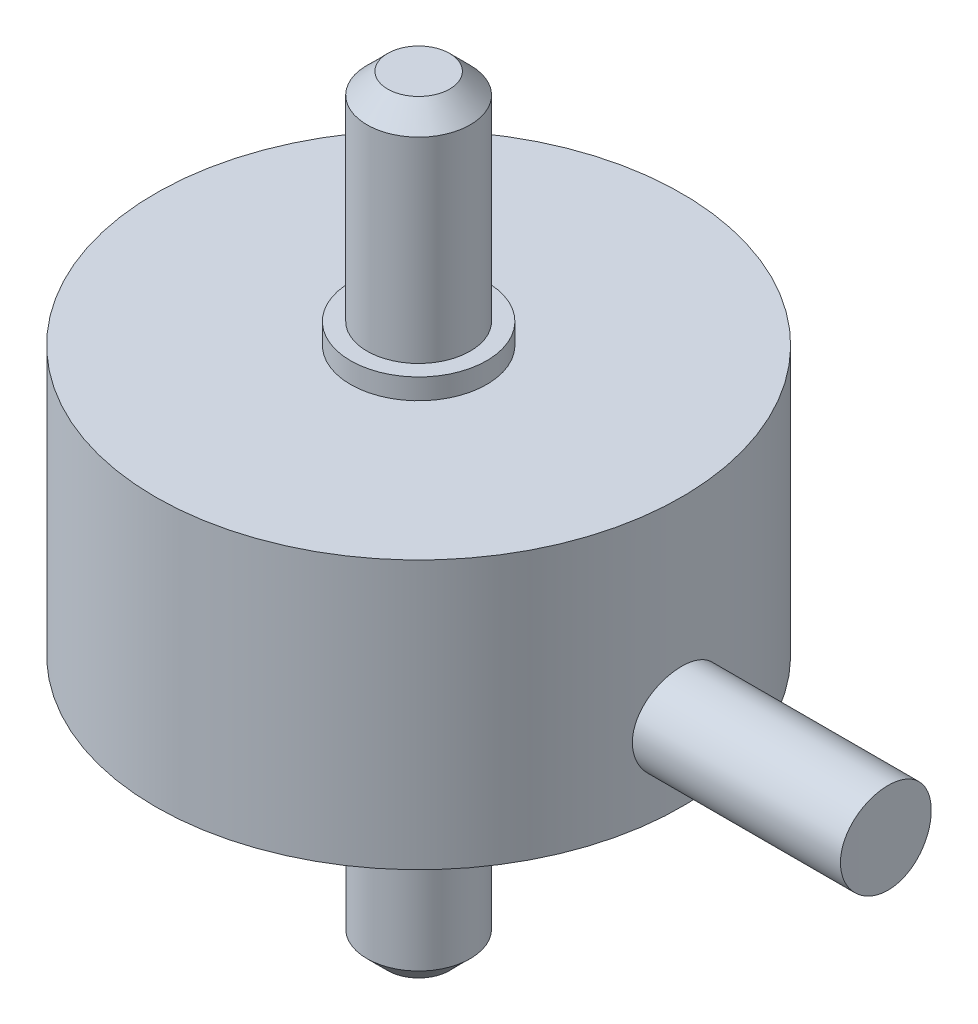
ISO-10303-21;
HEADER;
FILE_DESCRIPTION(('STEP AP214'),'2;1');
FILE_NAME('part.step','',(''),(''),'','','');
FILE_SCHEMA(('AUTOMOTIVE_DESIGN { 1 0 10303 214 1 1 1 1 }'));
ENDSEC;
DATA;
#1=APPLICATION_CONTEXT('core data for automotive mechanical design processes');
#2=APPLICATION_PROTOCOL_DEFINITION('international standard','automotive_design',2000,#1);
#3=PRODUCT_CONTEXT('',#1,'mechanical');
#4=PRODUCT('Part','Part','',(#3));
#5=PRODUCT_RELATED_PRODUCT_CATEGORY('part','',(#4));
#6=PRODUCT_DEFINITION_FORMATION('','',#4);
#7=PRODUCT_DEFINITION_CONTEXT('part definition',#1,'design');
#8=PRODUCT_DEFINITION('design','',#6,#7);
#9=PRODUCT_DEFINITION_SHAPE('','',#8);
#10=(LENGTH_UNIT() NAMED_UNIT(*) SI_UNIT(.MILLI.,.METRE.));
#11=(NAMED_UNIT(*) PLANE_ANGLE_UNIT() SI_UNIT($,.RADIAN.));
#12=(NAMED_UNIT(*) SI_UNIT($,.STERADIAN.) SOLID_ANGLE_UNIT());
#13=UNCERTAINTY_MEASURE_WITH_UNIT(LENGTH_MEASURE(1.E-05),#10,'distance_accuracy_value','');
#14=(GEOMETRIC_REPRESENTATION_CONTEXT(3) GLOBAL_UNCERTAINTY_ASSIGNED_CONTEXT((#13)) GLOBAL_UNIT_ASSIGNED_CONTEXT((#10,
#11,#12)) REPRESENTATION_CONTEXT('',''));
#15=CARTESIAN_POINT('',(0.,0.,0.));
#16=DIRECTION('',(0.,0.,1.));
#17=DIRECTION('',(1.,0.,0.));
#18=AXIS2_PLACEMENT_3D('',#15,#16,#17);
#19=CARTESIAN_POINT('',(0.,13.,0.));
#20=DIRECTION('',(0.,-1.,0.));
#21=DIRECTION('',(0.,0.,-1.));
#22=AXIS2_PLACEMENT_3D('',#19,#20,#21);
#23=CYLINDRICAL_SURFACE('',#22,12.75);
#24=CARTESIAN_POINT('',(0.,13.,0.));
#25=DIRECTION('',(0.,1.,0.));
#26=DIRECTION('',(0.,0.,1.));
#27=AXIS2_PLACEMENT_3D('',#24,#25,#26);
#28=CIRCLE('',#27,12.75);
#29=CARTESIAN_POINT('',(0.,13.,12.75));
#30=VERTEX_POINT('',#29);
#31=EDGE_CURVE('E65',#30,#30,#28,.T.);
#32=ORIENTED_EDGE('',*,*,#31,.F.);
#33=EDGE_LOOP('',(#32));
#34=FACE_BOUND('',#33,.T.);
#35=CARTESIAN_POINT('',(0.,0.,0.));
#36=DIRECTION('',(0.,1.,0.));
#37=DIRECTION('',(0.,0.,1.));
#38=AXIS2_PLACEMENT_3D('',#35,#36,#37);
#39=CIRCLE('',#38,12.75);
#40=CARTESIAN_POINT('',(0.,0.,12.75));
#41=VERTEX_POINT('',#40);
#42=EDGE_CURVE('E62',#41,#41,#39,.T.);
#43=ORIENTED_EDGE('',*,*,#42,.T.);
#44=EDGE_LOOP('',(#43));
#45=FACE_BOUND('',#44,.T.);
#46=CARTESIAN_POINT('',(12.5587618816506,3.7,2.2));
#47=CARTESIAN_POINT('',(12.558764145211,3.57741601941636,2.1999951300691));
#48=CARTESIAN_POINT('',(12.5605761259633,3.45476669925709,2.18971971719979));
#49=CARTESIAN_POINT('',(12.5676210136324,3.21291400293107,2.1489100761632));
#50=CARTESIAN_POINT('',(12.5728570067208,3.09371383690804,2.11835757123559));
#51=CARTESIAN_POINT('',(12.5861396398207,2.86229438356139,2.03794941431119));
#52=CARTESIAN_POINT('',(12.5941838575668,2.75006917787122,1.98811039410533));
#53=CARTESIAN_POINT('',(12.6121736966457,2.53558431675311,1.87058612862781));
#54=CARTESIAN_POINT('',(12.6221191218606,2.43332363508193,1.80290272381004));
#55=CARTESIAN_POINT('',(12.6429080797723,2.24058014444016,1.65084896242238));
#56=CARTESIAN_POINT('',(12.6537592129166,2.15021779713851,1.5663269262743));
#57=CARTESIAN_POINT('',(12.6750695280144,1.9848832180656,1.38332298841296));
#58=CARTESIAN_POINT('',(12.6855286860471,1.90991192431102,1.28484023647379));
#59=CARTESIAN_POINT('',(12.7049573019946,1.7770328541953,1.07592691018253));
#60=CARTESIAN_POINT('',(12.7139167755449,1.71923759801263,0.96542375964713));
#61=CARTESIAN_POINT('',(12.7292518154617,1.62307488997105,0.736096753077243));
#62=CARTESIAN_POINT('',(12.7356275617978,1.58470608491532,0.617273477257886));
#63=CARTESIAN_POINT('',(12.7450231099868,1.52885499604508,0.375924844809301));
#64=CARTESIAN_POINT('',(12.7480754440388,1.51117011225741,0.25344765954093));
#65=CARTESIAN_POINT('',(12.7505921227072,1.49655853013499,0.00722900119994269));
#66=CARTESIAN_POINT('',(12.7500567279236,1.49963032410894,-0.116512379394107));
#67=CARTESIAN_POINT('',(12.7454839365312,1.52628761022085,-0.360360505384306));
#68=CARTESIAN_POINT('',(12.741483768449,1.54965503583707,-0.480491887881929));
#69=CARTESIAN_POINT('',(12.7304724567652,1.61589648331229,-0.715102551351404));
#70=CARTESIAN_POINT('',(12.7234612163787,1.65877113219352,-0.829581650510338));
#71=CARTESIAN_POINT('',(12.7071524608722,1.763024254438,-1.05028228508836));
#72=CARTESIAN_POINT('',(12.697843974343,1.82449185340779,-1.15646087613953));
#73=CARTESIAN_POINT('',(12.6779736422168,1.96412064285438,-1.35707852047284));
#74=CARTESIAN_POINT('',(12.6674116881222,2.04228327888777,-1.45151655606626));
#75=CARTESIAN_POINT('',(12.6460457166708,2.21429079469124,-1.62726176168288));
#76=CARTESIAN_POINT('',(12.63524033744,2.3083263249781,-1.70838228089211));
#77=CARTESIAN_POINT('',(12.6147377182827,2.50876992074139,-1.85372498814461));
#78=CARTESIAN_POINT('',(12.6050404900548,2.61517811681004,-1.91794699780248));
#79=CARTESIAN_POINT('',(12.5878510612351,2.83757133678081,-2.02771078375993));
#80=CARTESIAN_POINT('',(12.5803616648609,2.95356830233734,-2.07322883237343));
#81=CARTESIAN_POINT('',(12.5684812610042,3.19172038420619,-2.14408067968787));
#82=CARTESIAN_POINT('',(12.5640899597937,3.31387491554738,-2.16941639189052));
#83=CARTESIAN_POINT('',(12.5589601416831,3.55920103913228,-2.19891893832093));
#84=CARTESIAN_POINT('',(12.5581756186313,3.6823396343254,-2.2033524092035));
#85=CARTESIAN_POINT('',(12.5602254891367,3.9275988562784,-2.19163630867206));
#86=CARTESIAN_POINT('',(12.5630597324058,4.04971952510094,-2.17548759204022));
#87=CARTESIAN_POINT('',(12.5719851875691,4.28862136561275,-2.12329328686249));
#88=CARTESIAN_POINT('',(12.5780539946138,4.40543333994228,-2.0873845153777));
#89=CARTESIAN_POINT('',(12.592745840685,4.63138196171483,-1.99683336183844));
#90=CARTESIAN_POINT('',(12.6013690423002,4.74051812004037,-1.94218978726805));
#91=CARTESIAN_POINT('',(12.6203043822508,4.94920057027949,-1.81509510463132));
#92=CARTESIAN_POINT('',(12.6306323297764,5.04864173753786,-1.74247378598701));
#93=CARTESIAN_POINT('',(12.6517677111912,5.23402227809365,-1.58171757031391));
#94=CARTESIAN_POINT('',(12.6625751812824,5.31996062974975,-1.49358150048674));
#95=CARTESIAN_POINT('',(12.6835980336756,5.47687580212762,-1.30311370913433));
#96=CARTESIAN_POINT('',(12.693805434754,5.5476743920002,-1.20063413779938));
#97=CARTESIAN_POINT('',(12.712348370174,5.67104936784518,-0.985080584234405));
#98=CARTESIAN_POINT('',(12.7206839683563,5.72362637532464,-0.872006963516456));
#99=CARTESIAN_POINT('',(12.7345095118409,5.80879120448086,-0.638994456213488));
#100=CARTESIAN_POINT('',(12.7400124937315,5.84147073010888,-0.519089893834596));
#101=CARTESIAN_POINT('',(12.7476080212052,5.88620757482463,-0.275391376894585));
#102=CARTESIAN_POINT('',(12.7497008684655,5.89826671809677,-0.151597767365264));
#103=CARTESIAN_POINT('',(12.750235585658,5.90136499556198,0.0946475837989805));
#104=CARTESIAN_POINT('',(12.7487244619706,5.89267476098572,0.21709590205133));
#105=CARTESIAN_POINT('',(12.7423174499606,5.85510832413695,0.458760772641978));
#106=CARTESIAN_POINT('',(12.737421584003,5.82623225524501,0.57797734632905));
#107=CARTESIAN_POINT('',(12.7247936743176,5.74922052136539,0.80968043920169));
#108=CARTESIAN_POINT('',(12.7170652536391,5.70110945227308,0.922175343068193));
#109=CARTESIAN_POINT('',(12.6996139697011,5.58702412770481,1.13753756520441));
#110=CARTESIAN_POINT('',(12.6898910010361,5.52104892810931,1.2404043742424));
#111=CARTESIAN_POINT('',(12.6693771586125,5.37215619662983,1.43494984127881));
#112=CARTESIAN_POINT('',(12.6585746704156,5.28904117573448,1.52647614584573));
#113=CARTESIAN_POINT('',(12.6371977366893,5.10864153979433,1.69437752008406));
#114=CARTESIAN_POINT('',(12.6266233451844,5.01135360931441,1.77074903473007));
#115=CARTESIAN_POINT('',(12.6068122578119,4.80448429393502,1.90671315621566));
#116=CARTESIAN_POINT('',(12.5975864086449,4.69481459735487,1.96617300091955));
#117=CARTESIAN_POINT('',(12.5816457275617,4.46692632033613,2.0657333701538));
#118=CARTESIAN_POINT('',(12.5749284257752,4.34871628618412,2.10585294814417));
#119=CARTESIAN_POINT('',(12.5662312236026,4.1417289073233,2.15703109635065));
#120=CARTESIAN_POINT('',(12.563446076839,4.05419432474286,2.1731181145955));
#121=CARTESIAN_POINT('',(12.5597106036917,3.87778460053774,2.19460422354284));
#122=CARTESIAN_POINT('',(12.5587602399027,3.78890948627949,2.20000353213407));
#123=CARTESIAN_POINT('',(12.5587618816506,3.7,2.2));
#124=B_SPLINE_CURVE_WITH_KNOTS('',3,(#46,#47,#48,#49,#50,#51,#52,#53,#54,#55,#56,#57,#58,#59,
#60,#61,#62,#63,#64,#65,#66,#67,#68,#69,#70,#71,#72,#73,#74,#75,#76,#77,#78,#79,#80,#81,#82,#83,
#84,#85,#86,#87,#88,#89,#90,#91,#92,#93,#94,#95,#96,#97,#98,#99,#100,#101,#102,#103,#104,#105,
#106,#107,#108,#109,#110,#111,#112,#113,#114,#115,#116,#117,#118,#119,#120,#121,#122,#123),
.UNSPECIFIED.,.T.,.F.,(4,2,2,2,2,2,2,2,2,2,2,2,2,2,2,2,2,2,2,2,2,2,2,2,2,2,2,2,2,2,2,2,2,2,2,2,
2,2,4),(0.,0.367426753184122,0.735185137130841,1.10262708759892,1.47003115524824,
1.84090795872338,2.21180735879407,2.58508551222389,2.95833766047514,3.32790232800345,
3.69744015195634,4.06305591566827,4.42868343222696,4.79609213771737,5.16353266856582,
5.53574967957126,5.90797061964615,6.28066230900627,6.65331865899456,7.021208167218,
7.3890823974181,7.75444097260647,8.11982280807834,8.48880601388051,8.85781712402222,
9.23095857109525,9.6040872896981,9.97548304379817,10.3468459406313,10.7133917170613,
11.0799350715144,11.4460112164991,11.8121067123906,12.1826831958991,12.5533465071019,
12.9268440303373,13.2999728390199,13.5664708734926,13.8329634748538),.UNSPECIFIED.);
#125=CARTESIAN_POINT('',(12.5587618816506,3.7,2.2));
#126=VERTEX_POINT('',#125);
#127=EDGE_CURVE('E11',#126,#126,#124,.T.);
#128=ORIENTED_EDGE('',*,*,#127,.F.);
#129=EDGE_LOOP('',(#128));
#130=FACE_BOUND('',#129,.T.);
#131=ADVANCED_FACE('F33',(#34,#45,#130),#23,.T.);
#132=CARTESIAN_POINT('',(0.,13.,0.));
#133=DIRECTION('',(0.,1.,0.));
#134=DIRECTION('',(0.,0.,1.));
#135=AXIS2_PLACEMENT_3D('',#132,#133,#134);
#136=PLANE('',#135);
#137=CARTESIAN_POINT('',(0.,13.,0.));
#138=DIRECTION('',(0.,1.,0.));
#139=DIRECTION('',(0.,0.,1.));
#140=AXIS2_PLACEMENT_3D('',#137,#138,#139);
#141=CIRCLE('',#140,3.3);
#142=CARTESIAN_POINT('',(0.,13.,3.3));
#143=VERTEX_POINT('',#142);
#144=EDGE_CURVE('E69',#143,#143,#141,.T.);
#145=ORIENTED_EDGE('',*,*,#144,.F.);
#146=EDGE_LOOP('',(#145));
#147=FACE_BOUND('',#146,.T.);
#148=ORIENTED_EDGE('',*,*,#31,.T.);
#149=EDGE_LOOP('',(#148));
#150=FACE_BOUND('',#149,.T.);
#151=ADVANCED_FACE('F104',(#147,#150),#136,.T.);
#152=CARTESIAN_POINT('',(0.,0.,0.));
#153=DIRECTION('',(0.,1.,0.));
#154=DIRECTION('',(0.,0.,1.));
#155=AXIS2_PLACEMENT_3D('',#152,#153,#154);
#156=PLANE('',#155);
#157=CARTESIAN_POINT('',(0.,0.,0.));
#158=DIRECTION('',(0.,-1.,0.));
#159=DIRECTION('',(0.,0.,-1.));
#160=AXIS2_PLACEMENT_3D('',#157,#158,#159);
#161=CIRCLE('',#160,5.);
#162=CARTESIAN_POINT('',(0.,0.,-5.));
#163=VERTEX_POINT('',#162);
#164=EDGE_CURVE('E78',#163,#163,#161,.T.);
#165=ORIENTED_EDGE('',*,*,#164,.F.);
#166=EDGE_LOOP('',(#165));
#167=FACE_BOUND('',#166,.T.);
#168=ORIENTED_EDGE('',*,*,#42,.F.);
#169=EDGE_LOOP('',(#168));
#170=FACE_BOUND('',#169,.T.);
#171=ADVANCED_FACE('F109',(#167,#170),#156,.F.);
#172=CARTESIAN_POINT('',(0.,14.,0.));
#173=DIRECTION('',(0.,-1.,0.));
#174=DIRECTION('',(0.,0.,-1.));
#175=AXIS2_PLACEMENT_3D('',#172,#173,#174);
#176=CYLINDRICAL_SURFACE('',#175,3.3);
#177=CARTESIAN_POINT('',(0.,14.,0.));
#178=DIRECTION('',(0.,1.,0.));
#179=DIRECTION('',(0.,0.,1.));
#180=AXIS2_PLACEMENT_3D('',#177,#178,#179);
#181=CIRCLE('',#180,3.3);
#182=CARTESIAN_POINT('',(0.,14.,3.3));
#183=VERTEX_POINT('',#182);
#184=EDGE_CURVE('E66',#183,#183,#181,.T.);
#185=ORIENTED_EDGE('',*,*,#184,.F.);
#186=EDGE_LOOP('',(#185));
#187=FACE_BOUND('',#186,.T.);
#188=ORIENTED_EDGE('',*,*,#144,.T.);
#189=EDGE_LOOP('',(#188));
#190=FACE_BOUND('',#189,.T.);
#191=ADVANCED_FACE('F151',(#187,#190),#176,.T.);
#192=CARTESIAN_POINT('',(0.,14.,0.));
#193=DIRECTION('',(0.,1.,0.));
#194=DIRECTION('',(0.,0.,1.));
#195=AXIS2_PLACEMENT_3D('',#192,#193,#194);
#196=PLANE('',#195);
#197=CARTESIAN_POINT('',(0.,14.,0.));
#198=DIRECTION('',(0.,1.,0.));
#199=DIRECTION('',(0.,0.,1.));
#200=AXIS2_PLACEMENT_3D('',#197,#198,#199);
#201=CIRCLE('',#200,2.5);
#202=CARTESIAN_POINT('',(0.,14.,-2.5));
#203=VERTEX_POINT('',#202);
#204=EDGE_CURVE('E72',#203,#203,#201,.T.);
#205=ORIENTED_EDGE('',*,*,#204,.F.);
#206=EDGE_LOOP('',(#205));
#207=FACE_BOUND('',#206,.T.);
#208=ORIENTED_EDGE('',*,*,#184,.T.);
#209=EDGE_LOOP('',(#208));
#210=FACE_BOUND('',#209,.T.);
#211=ADVANCED_FACE('F157',(#207,#210),#196,.T.);
#212=CARTESIAN_POINT('',(0.,24.5,0.));
#213=DIRECTION('',(0.,-1.,0.));
#214=DIRECTION('',(0.,0.,-1.));
#215=AXIS2_PLACEMENT_3D('',#212,#213,#214);
#216=CYLINDRICAL_SURFACE('',#215,2.5);
#217=CARTESIAN_POINT('',(0.,23.5,0.));
#218=DIRECTION('',(0.,1.,0.));
#219=DIRECTION('',(0.,0.,1.));
#220=AXIS2_PLACEMENT_3D('',#217,#218,#219);
#221=CIRCLE('',#220,2.5);
#222=CARTESIAN_POINT('',(0.,23.5,-2.5));
#223=VERTEX_POINT('',#222);
#224=EDGE_CURVE('E45',#223,#223,#221,.F.);
#225=CARTESIAN_POINT('',(0.,23.5,-2.5));
#226=CARTESIAN_POINT('',(0.,23.4010416666667,-2.5));
#227=CARTESIAN_POINT('',(0.,23.3020833333334,-2.5));
#228=CARTESIAN_POINT('',(0.,23.1041666666667,-2.5));
#229=CARTESIAN_POINT('',(0.,23.0052083333333,-2.5));
#230=CARTESIAN_POINT('',(0.,22.8072916666667,-2.5));
#231=CARTESIAN_POINT('',(0.,22.7083333333333,-2.5));
#232=CARTESIAN_POINT('',(0.,22.5104166666667,-2.5));
#233=CARTESIAN_POINT('',(0.,22.4114583333333,-2.5));
#234=CARTESIAN_POINT('',(0.,22.2135416666667,-2.5));
#235=CARTESIAN_POINT('',(0.,22.1145833333333,-2.5));
#236=CARTESIAN_POINT('',(0.,21.9166666666667,-2.5));
#237=CARTESIAN_POINT('',(0.,21.8177083333333,-2.5));
#238=CARTESIAN_POINT('',(0.,21.6197916666667,-2.5));
#239=CARTESIAN_POINT('',(0.,21.5208333333333,-2.5));
#240=CARTESIAN_POINT('',(0.,21.3229166666667,-2.5));
#241=CARTESIAN_POINT('',(0.,21.2239583333333,-2.5));
#242=CARTESIAN_POINT('',(0.,21.0260416666667,-2.5));
#243=CARTESIAN_POINT('',(0.,20.9270833333333,-2.5));
#244=CARTESIAN_POINT('',(0.,20.7291666666667,-2.5));
#245=CARTESIAN_POINT('',(0.,20.6302083333333,-2.5));
#246=CARTESIAN_POINT('',(0.,20.4322916666667,-2.5));
#247=CARTESIAN_POINT('',(0.,20.3333333333333,-2.5));
#248=CARTESIAN_POINT('',(0.,20.1354166666667,-2.5));
#249=CARTESIAN_POINT('',(0.,20.0364583333333,-2.5));
#250=CARTESIAN_POINT('',(0.,19.8385416666667,-2.5));
#251=CARTESIAN_POINT('',(0.,19.7395833333333,-2.5));
#252=CARTESIAN_POINT('',(0.,19.5416666666667,-2.5));
#253=CARTESIAN_POINT('',(0.,19.4427083333333,-2.5));
#254=CARTESIAN_POINT('',(0.,19.2447916666667,-2.5));
#255=CARTESIAN_POINT('',(0.,19.1458333333333,-2.5));
#256=CARTESIAN_POINT('',(0.,18.9479166666667,-2.5));
#257=CARTESIAN_POINT('',(0.,18.8489583333333,-2.5));
#258=CARTESIAN_POINT('',(0.,18.6510416666667,-2.5));
#259=CARTESIAN_POINT('',(0.,18.5520833333333,-2.5));
#260=CARTESIAN_POINT('',(0.,18.3541666666667,-2.5));
#261=CARTESIAN_POINT('',(0.,18.2552083333333,-2.5));
#262=CARTESIAN_POINT('',(0.,18.0572916666667,-2.5));
#263=CARTESIAN_POINT('',(0.,17.9583333333333,-2.5));
#264=CARTESIAN_POINT('',(0.,17.7604166666667,-2.5));
#265=CARTESIAN_POINT('',(0.,17.6614583333333,-2.5));
#266=CARTESIAN_POINT('',(0.,17.4635416666667,-2.5));
#267=CARTESIAN_POINT('',(0.,17.3645833333333,-2.5));
#268=CARTESIAN_POINT('',(0.,17.1666666666667,-2.5));
#269=CARTESIAN_POINT('',(0.,17.0677083333333,-2.5));
#270=CARTESIAN_POINT('',(0.,16.8697916666667,-2.5));
#271=CARTESIAN_POINT('',(0.,16.7708333333333,-2.5));
#272=CARTESIAN_POINT('',(0.,16.5729166666667,-2.5));
#273=CARTESIAN_POINT('',(0.,16.4739583333333,-2.5));
#274=CARTESIAN_POINT('',(0.,16.2760416666667,-2.5));
#275=CARTESIAN_POINT('',(0.,16.1770833333333,-2.5));
#276=CARTESIAN_POINT('',(0.,15.9791666666667,-2.5));
#277=CARTESIAN_POINT('',(0.,15.8802083333333,-2.5));
#278=CARTESIAN_POINT('',(0.,15.6822916666667,-2.5));
#279=CARTESIAN_POINT('',(0.,15.5833333333333,-2.5));
#280=CARTESIAN_POINT('',(0.,15.3854166666667,-2.5));
#281=CARTESIAN_POINT('',(0.,15.2864583333333,-2.5));
#282=CARTESIAN_POINT('',(0.,15.0885416666667,-2.5));
#283=CARTESIAN_POINT('',(0.,14.9895833333333,-2.5));
#284=CARTESIAN_POINT('',(0.,14.7916666666667,-2.5));
#285=CARTESIAN_POINT('',(0.,14.6927083333333,-2.5));
#286=CARTESIAN_POINT('',(0.,14.4947916666667,-2.5));
#287=CARTESIAN_POINT('',(0.,14.3958333333333,-2.5));
#288=CARTESIAN_POINT('',(0.,14.1979166666667,-2.5));
#289=CARTESIAN_POINT('',(0.,14.0989583333333,-2.5));
#290=CARTESIAN_POINT('',(0.,14.,-2.5));
#291=B_SPLINE_CURVE_WITH_KNOTS('',3,(#225,#226,#227,#228,#229,#230,#231,#232,#233,#234,#235,
#236,#237,#238,#239,#240,#241,#242,#243,#244,#245,#246,#247,#248,#249,#250,#251,#252,#253,#254,
#255,#256,#257,#258,#259,#260,#261,#262,#263,#264,#265,#266,#267,#268,#269,#270,#271,#272,#273,
#274,#275,#276,#277,#278,#279,#280,#281,#282,#283,#284,#285,#286,#287,#288,#289,#290),
.UNSPECIFIED.,.F.,.F.,(4,2,2,2,2,2,2,2,2,2,2,2,2,2,2,2,2,2,2,2,2,2,2,2,2,2,2,2,2,2,2,2,4),(0.,
0.296874999999999,0.593750000000001,0.890625000000003,1.1875,1.484375,1.78125,2.078125,
2.37500000000001,2.671875,2.96875000000001,3.265625,3.56250000000001,3.85937500000001,
4.15625000000001,4.45312500000001,4.75000000000001,5.04687500000001,5.34375000000001,
5.64062500000001,5.93750000000001,6.23437500000001,6.53125000000001,6.82812500000002,
7.12500000000002,7.42187500000002,7.71875000000002,8.01562500000002,8.31250000000002,
8.60937500000002,8.90625000000002,9.20312500000002,9.50000000000002),.UNSPECIFIED.);
#292=EDGE_CURVE('BSEAM163',#223,#203,#291,.T.);
#293=ORIENTED_EDGE('',*,*,#224,.T.);
#294=ORIENTED_EDGE('',*,*,#204,.T.);
#295=ORIENTED_EDGE('',*,*,#292,.T.);
#296=ORIENTED_EDGE('',*,*,#292,.F.);
#297=EDGE_LOOP('',(#293,#295,#294,#296));
#298=FACE_BOUND('',#297,.T.);
#299=ADVANCED_FACE('F163',(#298),#216,.T.);
#300=CARTESIAN_POINT('',(0.,24.5,0.));
#301=DIRECTION('',(0.,1.,0.));
#302=DIRECTION('',(0.,0.,1.));
#303=AXIS2_PLACEMENT_3D('',#300,#301,#302);
#304=PLANE('',#303);
#305=CARTESIAN_POINT('',(0.,24.5,0.));
#306=DIRECTION('',(0.,1.,0.));
#307=DIRECTION('',(0.,0.,1.));
#308=AXIS2_PLACEMENT_3D('',#305,#306,#307);
#309=CIRCLE('',#308,1.50000000000002);
#310=CARTESIAN_POINT('',(0.,24.5,1.50000000000002));
#311=VERTEX_POINT('',#310);
#312=EDGE_CURVE('E49',#311,#311,#309,.T.);
#313=ORIENTED_EDGE('',*,*,#312,.T.);
#314=EDGE_LOOP('',(#313));
#315=FACE_BOUND('',#314,.T.);
#316=ADVANCED_FACE('F145',(#315),#304,.T.);
#317=CARTESIAN_POINT('',(0.,-2.,0.));
#318=DIRECTION('',(0.,1.,0.));
#319=DIRECTION('',(0.,0.,1.));
#320=AXIS2_PLACEMENT_3D('',#317,#318,#319);
#321=CYLINDRICAL_SURFACE('',#320,5.);
#322=CARTESIAN_POINT('',(0.,-2.,0.));
#323=DIRECTION('',(0.,-1.,0.));
#324=DIRECTION('',(0.,0.,-1.));
#325=AXIS2_PLACEMENT_3D('',#322,#323,#324);
#326=CIRCLE('',#325,5.);
#327=CARTESIAN_POINT('',(0.,-2.,-5.));
#328=VERTEX_POINT('',#327);
#329=EDGE_CURVE('E75',#328,#328,#326,.T.);
#330=ORIENTED_EDGE('',*,*,#329,.F.);
#331=EDGE_LOOP('',(#330));
#332=FACE_BOUND('',#331,.T.);
#333=ORIENTED_EDGE('',*,*,#164,.T.);
#334=EDGE_LOOP('',(#333));
#335=FACE_BOUND('',#334,.T.);
#336=ADVANCED_FACE('F139',(#332,#335),#321,.T.);
#337=CARTESIAN_POINT('',(0.,-2.,0.));
#338=DIRECTION('',(0.,-1.,0.));
#339=DIRECTION('',(0.,0.,-1.));
#340=AXIS2_PLACEMENT_3D('',#337,#338,#339);
#341=PLANE('',#340);
#342=CARTESIAN_POINT('',(0.,-2.,0.));
#343=DIRECTION('',(0.,-1.,0.));
#344=DIRECTION('',(0.,0.,-1.));
#345=AXIS2_PLACEMENT_3D('',#342,#343,#344);
#346=CIRCLE('',#345,2.5);
#347=CARTESIAN_POINT('',(0.,-2.,2.5));
#348=VERTEX_POINT('',#347);
#349=EDGE_CURVE('E61',#348,#348,#346,.T.);
#350=ORIENTED_EDGE('',*,*,#349,.F.);
#351=EDGE_LOOP('',(#350));
#352=FACE_BOUND('',#351,.T.);
#353=ORIENTED_EDGE('',*,*,#329,.T.);
#354=EDGE_LOOP('',(#353));
#355=FACE_BOUND('',#354,.T.);
#356=ADVANCED_FACE('F133',(#352,#355),#341,.T.);
#357=CARTESIAN_POINT('',(0.,-12.5,0.));
#358=DIRECTION('',(0.,1.,0.));
#359=DIRECTION('',(0.,0.,1.));
#360=AXIS2_PLACEMENT_3D('',#357,#358,#359);
#361=CYLINDRICAL_SURFACE('',#360,2.5);
#362=CARTESIAN_POINT('',(0.,-11.5,0.));
#363=DIRECTION('',(0.,-1.,0.));
#364=DIRECTION('',(0.,0.,-1.));
#365=AXIS2_PLACEMENT_3D('',#362,#363,#364);
#366=CIRCLE('',#365,2.5);
#367=CARTESIAN_POINT('',(0.,-11.5,2.5));
#368=VERTEX_POINT('',#367);
#369=EDGE_CURVE('E53',#368,#368,#366,.F.);
#370=CARTESIAN_POINT('',(0.,-11.5,2.5));
#371=CARTESIAN_POINT('',(0.,-11.4010416666667,2.5));
#372=CARTESIAN_POINT('',(0.,-11.3020833333334,2.5));
#373=CARTESIAN_POINT('',(0.,-11.1041666666667,2.5));
#374=CARTESIAN_POINT('',(0.,-11.0052083333334,2.5));
#375=CARTESIAN_POINT('',(0.,-10.8072916666667,2.5));
#376=CARTESIAN_POINT('',(0.,-10.7083333333334,2.5));
#377=CARTESIAN_POINT('',(0.,-10.5104166666667,2.5));
#378=CARTESIAN_POINT('',(0.,-10.4114583333333,2.5));
#379=CARTESIAN_POINT('',(0.,-10.2135416666667,2.5));
#380=CARTESIAN_POINT('',(0.,-10.1145833333333,2.5));
#381=CARTESIAN_POINT('',(0.,-9.91666666666668,2.5));
#382=CARTESIAN_POINT('',(0.,-9.81770833333335,2.5));
#383=CARTESIAN_POINT('',(0.,-9.61979166666668,2.5));
#384=CARTESIAN_POINT('',(0.,-9.52083333333335,2.5));
#385=CARTESIAN_POINT('',(0.,-9.32291666666668,2.5));
#386=CARTESIAN_POINT('',(0.,-9.22395833333335,2.5));
#387=CARTESIAN_POINT('',(0.,-9.02604166666668,2.5));
#388=CARTESIAN_POINT('',(0.,-8.92708333333335,2.5));
#389=CARTESIAN_POINT('',(0.,-8.72916666666668,2.5));
#390=CARTESIAN_POINT('',(0.,-8.63020833333335,2.5));
#391=CARTESIAN_POINT('',(0.,-8.43229166666668,2.5));
#392=CARTESIAN_POINT('',(0.,-8.33333333333335,2.5));
#393=CARTESIAN_POINT('',(0.,-8.13541666666668,2.5));
#394=CARTESIAN_POINT('',(0.,-8.03645833333335,2.5));
#395=CARTESIAN_POINT('',(0.,-7.83854166666668,2.5));
#396=CARTESIAN_POINT('',(0.,-7.73958333333335,2.5));
#397=CARTESIAN_POINT('',(0.,-7.54166666666668,2.5));
#398=CARTESIAN_POINT('',(0.,-7.44270833333334,2.5));
#399=CARTESIAN_POINT('',(0.,-7.24479166666668,2.5));
#400=CARTESIAN_POINT('',(0.,-7.14583333333334,2.5));
#401=CARTESIAN_POINT('',(0.,-6.94791666666668,2.5));
#402=CARTESIAN_POINT('',(0.,-6.84895833333334,2.5));
#403=CARTESIAN_POINT('',(0.,-6.65104166666668,2.5));
#404=CARTESIAN_POINT('',(0.,-6.55208333333334,2.5));
#405=CARTESIAN_POINT('',(0.,-6.35416666666668,2.5));
#406=CARTESIAN_POINT('',(0.,-6.25520833333334,2.5));
#407=CARTESIAN_POINT('',(0.,-6.05729166666667,2.5));
#408=CARTESIAN_POINT('',(0.,-5.95833333333334,2.5));
#409=CARTESIAN_POINT('',(0.,-5.76041666666667,2.5));
#410=CARTESIAN_POINT('',(0.,-5.66145833333334,2.5));
#411=CARTESIAN_POINT('',(0.,-5.46354166666667,2.5));
#412=CARTESIAN_POINT('',(0.,-5.36458333333334,2.5));
#413=CARTESIAN_POINT('',(0.,-5.16666666666667,2.5));
#414=CARTESIAN_POINT('',(0.,-5.06770833333334,2.5));
#415=CARTESIAN_POINT('',(0.,-4.86979166666667,2.5));
#416=CARTESIAN_POINT('',(0.,-4.77083333333334,2.5));
#417=CARTESIAN_POINT('',(0.,-4.57291666666667,2.5));
#418=CARTESIAN_POINT('',(0.,-4.47395833333334,2.5));
#419=CARTESIAN_POINT('',(0.,-4.27604166666667,2.5));
#420=CARTESIAN_POINT('',(0.,-4.17708333333334,2.5));
#421=CARTESIAN_POINT('',(0.,-3.97916666666667,2.5));
#422=CARTESIAN_POINT('',(0.,-3.88020833333334,2.5));
#423=CARTESIAN_POINT('',(0.,-3.68229166666667,2.5));
#424=CARTESIAN_POINT('',(0.,-3.58333333333334,2.5));
#425=CARTESIAN_POINT('',(0.,-3.38541666666667,2.5));
#426=CARTESIAN_POINT('',(0.,-3.28645833333334,2.5));
#427=CARTESIAN_POINT('',(0.,-3.08854166666667,2.5));
#428=CARTESIAN_POINT('',(0.,-2.98958333333334,2.5));
#429=CARTESIAN_POINT('',(0.,-2.79166666666667,2.5));
#430=CARTESIAN_POINT('',(0.,-2.69270833333333,2.5));
#431=CARTESIAN_POINT('',(0.,-2.49479166666667,2.5));
#432=CARTESIAN_POINT('',(0.,-2.39583333333333,2.5));
#433=CARTESIAN_POINT('',(0.,-2.19791666666667,2.5));
#434=CARTESIAN_POINT('',(0.,-2.09895833333333,2.5));
#435=CARTESIAN_POINT('',(0.,-2.,2.5));
#436=B_SPLINE_CURVE_WITH_KNOTS('',3,(#370,#371,#372,#373,#374,#375,#376,#377,#378,#379,#380,
#381,#382,#383,#384,#385,#386,#387,#388,#389,#390,#391,#392,#393,#394,#395,#396,#397,#398,#399,
#400,#401,#402,#403,#404,#405,#406,#407,#408,#409,#410,#411,#412,#413,#414,#415,#416,#417,#418,
#419,#420,#421,#422,#423,#424,#425,#426,#427,#428,#429,#430,#431,#432,#433,#434,#435),
.UNSPECIFIED.,.F.,.F.,(4,2,2,2,2,2,2,2,2,2,2,2,2,2,2,2,2,2,2,2,2,2,2,2,2,2,2,2,2,2,2,2,4),(0.,
0.296875,0.593750000000001,0.890625000000001,1.1875,1.484375,1.78125,2.078125,2.375,
2.67187500000001,2.96875,3.26562500000001,3.5625,3.85937500000001,4.15625000000001,
4.45312500000001,4.75000000000001,5.04687500000001,5.34375000000001,5.64062500000001,
5.93750000000001,6.23437500000001,6.53125000000001,6.82812500000001,7.12500000000001,
7.42187500000001,7.71875000000001,8.01562500000002,8.31250000000002,8.60937500000002,
8.90625000000002,9.20312500000002,9.50000000000002),.UNSPECIFIED.);
#437=EDGE_CURVE('BSEAM125',#368,#348,#436,.T.);
#438=ORIENTED_EDGE('',*,*,#369,.T.);
#439=ORIENTED_EDGE('',*,*,#349,.T.);
#440=ORIENTED_EDGE('',*,*,#437,.T.);
#441=ORIENTED_EDGE('',*,*,#437,.F.);
#442=EDGE_LOOP('',(#438,#440,#439,#441));
#443=FACE_BOUND('',#442,.T.);
#444=ADVANCED_FACE('F125',(#443),#361,.T.);
#445=CARTESIAN_POINT('',(0.,-12.5,0.));
#446=DIRECTION('',(0.,-1.,0.));
#447=DIRECTION('',(0.,0.,-1.));
#448=AXIS2_PLACEMENT_3D('',#445,#446,#447);
#449=PLANE('',#448);
#450=CARTESIAN_POINT('',(0.,-12.5,0.));
#451=DIRECTION('',(0.,-1.,0.));
#452=DIRECTION('',(0.,0.,-1.));
#453=AXIS2_PLACEMENT_3D('',#450,#451,#452);
#454=CIRCLE('',#453,1.50000000000002);
#455=CARTESIAN_POINT('',(0.,-12.5,-1.50000000000002));
#456=VERTEX_POINT('',#455);
#457=EDGE_CURVE('E58',#456,#456,#454,.T.);
#458=ORIENTED_EDGE('',*,*,#457,.T.);
#459=EDGE_LOOP('',(#458));
#460=FACE_BOUND('',#459,.T.);
#461=ADVANCED_FACE('F118',(#460),#449,.T.);
#462=CARTESIAN_POINT('',(0.,-12.5,0.));
#463=DIRECTION('',(0.,1.,0.));
#464=DIRECTION('',(0.,0.,1.));
#465=AXIS2_PLACEMENT_3D('',#462,#463,#464);
#466=CONICAL_SURFACE('',#465,1.50000000000002,0.785398163397447);
#467=ORIENTED_EDGE('',*,*,#369,.F.);
#468=EDGE_LOOP('',(#467));
#469=FACE_BOUND('',#468,.T.);
#470=ORIENTED_EDGE('',*,*,#457,.F.);
#471=EDGE_LOOP('',(#470));
#472=FACE_BOUND('',#471,.T.);
#473=ADVANCED_FACE('F116',(#469,#472),#466,.T.);
#474=CARTESIAN_POINT('',(0.,24.5,0.));
#475=DIRECTION('',(0.,-1.,0.));
#476=DIRECTION('',(0.,0.,-1.));
#477=AXIS2_PLACEMENT_3D('',#474,#475,#476);
#478=CONICAL_SURFACE('',#477,1.50000000000002,0.785398163397447);
#479=ORIENTED_EDGE('',*,*,#224,.F.);
#480=EDGE_LOOP('',(#479));
#481=FACE_BOUND('',#480,.T.);
#482=ORIENTED_EDGE('',*,*,#312,.F.);
#483=EDGE_LOOP('',(#482));
#484=FACE_BOUND('',#483,.T.);
#485=ADVANCED_FACE('F35',(#481,#484),#478,.T.);
#486=CARTESIAN_POINT('',(32.751,3.7,0.));
#487=DIRECTION('',(-1.,0.,0.));
#488=DIRECTION('',(0.,0.,1.));
#489=AXIS2_PLACEMENT_3D('',#486,#487,#488);
#490=CYLINDRICAL_SURFACE('',#489,2.2);
#491=CARTESIAN_POINT('',(22.6433765149988,3.7,2.2));
#492=CARTESIAN_POINT('',(22.6433779156779,3.82326459328564,2.19999465044567));
#493=CARTESIAN_POINT('',(22.6443938902296,3.94661120185961,2.18960546318747));
#494=CARTESIAN_POINT('',(22.6483475623935,4.1898860734283,2.14831706001147));
#495=CARTESIAN_POINT('',(22.6512873904328,4.30981039284191,2.11739510606537));
#496=CARTESIAN_POINT('',(22.6587527248733,4.5426823787848,2.03594869873794));
#497=CARTESIAN_POINT('',(22.6632772830427,4.65563416993069,1.98543596567111));
#498=CARTESIAN_POINT('',(22.6734011029921,4.8714311956093,1.86626403953811));
#499=CARTESIAN_POINT('',(22.6790001478094,4.97427846414322,1.79760850885563));
#500=CARTESIAN_POINT('',(22.6906634628074,5.16732258738148,1.64384813159436));
#501=CARTESIAN_POINT('',(22.696729091341,5.2574801632785,1.55869406929028));
#502=CARTESIAN_POINT('',(22.7086297786027,5.42224758411981,1.37445882529454));
#503=CARTESIAN_POINT('',(22.7144648268738,5.4968567245941,1.27537701290347));
#504=CARTESIAN_POINT('',(22.725260217466,5.62854421823662,1.06585938499477));
#505=CARTESIAN_POINT('',(22.7302188243381,5.68558795205892,0.95540171325434));
#506=CARTESIAN_POINT('',(22.7386878766974,5.78030390382811,0.726419744651092));
#507=CARTESIAN_POINT('',(22.7421983553677,5.81797656565884,0.607895632699446));
#508=CARTESIAN_POINT('',(22.7473660889917,5.87276617867108,0.366541052977199));
#509=CARTESIAN_POINT('',(22.7490291431594,5.88994746649955,0.24372531632706));
#510=CARTESIAN_POINT('',(22.7503343556678,5.90346564840447,-0.00305707616537795));
#511=CARTESIAN_POINT('',(22.7499765632671,5.89980305055639,-0.127023703880852));
#512=CARTESIAN_POINT('',(22.7472851506907,5.87178973728073,-0.372152280339341));
#513=CARTESIAN_POINT('',(22.7449581378557,5.84750820379168,-0.493322217868726));
#514=CARTESIAN_POINT('',(22.7385974421404,5.77905401585705,-0.729858800399612));
#515=CARTESIAN_POINT('',(22.7345637383287,5.73488111745674,-0.845225374207318));
#516=CARTESIAN_POINT('',(22.7252318609382,5.62782198639812,-1.06709890605082));
#517=CARTESIAN_POINT('',(22.7199316163036,5.56490506137151,-1.17359096366904));
#518=CARTESIAN_POINT('',(22.7086615804408,5.42216614336189,-1.37452994637844));
#519=CARTESIAN_POINT('',(22.7026917708607,5.34234368696682,-1.46897654116733));
#520=CARTESIAN_POINT('',(22.6907239093995,5.16767031594693,-1.64354866383336));
#521=CARTESIAN_POINT('',(22.6847258419233,5.07275923373778,-1.72361400034362));
#522=CARTESIAN_POINT('',(22.6734019051533,4.87081162354958,-1.86668505321152));
#523=CARTESIAN_POINT('',(22.6680760367341,4.76377507979675,-1.92969074737623));
#524=CARTESIAN_POINT('',(22.6586989238256,4.54056951081996,-2.03685330009405));
#525=CARTESIAN_POINT('',(22.6546479222941,4.42439875010893,-2.08100656641779));
#526=CARTESIAN_POINT('',(22.6482841855804,4.18624469302797,-2.14916393294114));
#527=CARTESIAN_POINT('',(22.6459714009431,4.0642615621342,-2.17316860640242));
#528=CARTESIAN_POINT('',(22.6433544147124,3.81847347003226,-2.20027021645776));
#529=CARTESIAN_POINT('',(22.6430421289945,3.6946778701344,-2.20345130343424));
#530=CARTESIAN_POINT('',(22.6444401649291,3.4483153315973,-2.18903631813644));
#531=CARTESIAN_POINT('',(22.6461504610547,3.3257483774711,-2.17144050808586));
#532=CARTESIAN_POINT('',(22.6513935954277,3.08556685646543,-2.11604156056932));
#533=CARTESIAN_POINT('',(22.6549228544141,2.96794305251787,-2.07827810269392));
#534=CARTESIAN_POINT('',(22.6634033386554,2.74069982297596,-1.9836562982311));
#535=CARTESIAN_POINT('',(22.6683545944303,2.63108056924418,-1.92679754180264));
#536=CARTESIAN_POINT('',(22.6791407665204,2.42257424599878,-1.79538789527859));
#537=CARTESIAN_POINT('',(22.684978449854,2.32372250787053,-1.72078117586078));
#538=CARTESIAN_POINT('',(22.6968705982452,2.13991528448396,-1.55607356390747));
#539=CARTESIAN_POINT('',(22.7029250683187,2.05496012100839,-1.46597231268672));
#540=CARTESIAN_POINT('',(22.7145929373856,1.90106804669282,-1.2724685185357));
#541=CARTESIAN_POINT('',(22.7202047840314,1.83218598503353,-1.1690222478662));
#542=CARTESIAN_POINT('',(22.7303325518557,1.71277262538849,-0.951981261007912));
#543=CARTESIAN_POINT('',(22.7348484872005,1.66224109019024,-0.838386676027413));
#544=CARTESIAN_POINT('',(22.7422685701879,1.58105639233998,-0.604466132067076));
#545=CARTESIAN_POINT('',(22.7451754163226,1.55036993424678,-0.484151817706543));
#546=CARTESIAN_POINT('',(22.7490608464964,1.50963776897095,-0.240049027306475));
#547=CARTESIAN_POINT('',(22.7500394809674,1.49959152194841,-0.116260642216291));
#548=CARTESIAN_POINT('',(22.7499582187115,1.5004322646838,0.130737244468445));
#549=CARTESIAN_POINT('',(22.7489066206839,1.51123403683836,0.253947047747426));
#550=CARTESIAN_POINT('',(22.7448994306621,1.55328570869919,0.496793229024372));
#551=CARTESIAN_POINT('',(22.741943836915,1.58453562722966,0.616429603732594));
#552=CARTESIAN_POINT('',(22.7344599022024,1.66657331058399,0.848733511476856));
#553=CARTESIAN_POINT('',(22.7299317460912,1.71735877908214,0.961401861770131));
#554=CARTESIAN_POINT('',(22.7198078299399,1.83701675639413,1.176628184289));
#555=CARTESIAN_POINT('',(22.7142120783838,1.90588912147391,1.27918623685083));
#556=CARTESIAN_POINT('',(22.7025527719544,2.06008562636292,1.47171739724226));
#557=CARTESIAN_POINT('',(22.6964874701043,2.14547316781962,1.5616396222157));
#558=CARTESIAN_POINT('',(22.684587476429,2.33015283214812,1.72591824157741));
#559=CARTESIAN_POINT('',(22.6787528403973,2.42944829301057,1.80027088844597));
#560=CARTESIAN_POINT('',(22.6679597825725,2.63938338776526,1.93143842275654));
#561=CARTESIAN_POINT('',(22.6630034959008,2.75004965890111,1.98821081901628));
#562=CARTESIAN_POINT('',(22.6545538520269,2.97932053135703,2.08229235574924));
#563=CARTESIAN_POINT('',(22.6510588388542,3.09791596921846,2.11962353959334));
#564=CARTESIAN_POINT('',(22.6468125698538,3.29765751609575,2.16441143464587));
#565=CARTESIAN_POINT('',(22.6455301064652,3.37752494277221,2.17773901408492));
#566=CARTESIAN_POINT('',(22.643811621071,3.5382498083942,2.1955350349992));
#567=CARTESIAN_POINT('',(22.643375595799,3.61910724351816,2.20000351066096));
#568=CARTESIAN_POINT('',(22.6433765149988,3.7,2.2));
#569=B_SPLINE_CURVE_WITH_KNOTS('',3,(#491,#492,#493,#494,#495,#496,#497,#498,#499,#500,#501,
#502,#503,#504,#505,#506,#507,#508,#509,#510,#511,#512,#513,#514,#515,#516,#517,#518,#519,#520,
#521,#522,#523,#524,#525,#526,#527,#528,#529,#530,#531,#532,#533,#534,#535,#536,#537,#538,#539,
#540,#541,#542,#543,#544,#545,#546,#547,#548,#549,#550,#551,#552,#553,#554,#555,#556,#557,#558,
#559,#560,#561,#562,#563,#564,#565,#566,#567,#568),.UNSPECIFIED.,.T.,.F.,(4,2,2,2,2,2,2,2,2,2,2,
2,2,2,2,2,2,2,2,2,2,2,2,2,2,2,2,2,2,2,2,2,2,2,2,2,2,2,4),(0.,0.369498384860239,
0.739406636926328,1.10909392942722,1.47870665218167,1.84943940793712,2.2201889572376,
2.59166460120499,2.96313173251081,3.33342947427606,3.70371818997018,4.07276937678208,
4.44182508989144,4.81148846544642,5.18116197547418,5.55234838796952,5.92353528333981,
6.29479287485992,6.66603990311311,7.03578575059459,7.40552693159068,7.77454331715773,
8.14356762340345,8.51376847869344,8.88397790497265,9.25543276896352,9.62688283108281,
9.99770805806009,10.3685235860666,10.7378265916366,11.107129937181,11.4763898858541,
11.8456469001584,12.2163506828156,12.5871435897214,12.9588258253915,13.330085707453,
13.5725710587841,13.8150554743832),.UNSPECIFIED.);
#570=CARTESIAN_POINT('',(22.6433765149988,3.7,2.2));
#571=VERTEX_POINT('',#570);
#572=EDGE_CURVE('E83',#571,#571,#569,.T.);
#573=ORIENTED_EDGE('',*,*,#572,.T.);
#574=EDGE_LOOP('',(#573));
#575=FACE_BOUND('',#574,.T.);
#576=ORIENTED_EDGE('',*,*,#127,.T.);
#577=EDGE_LOOP('',(#576));
#578=FACE_BOUND('',#577,.T.);
#579=ADVANCED_FACE('F91',(#575,#578),#490,.T.);
#580=CARTESIAN_POINT('',(0.,13.,0.));
#581=DIRECTION('',(0.,-1.,0.));
#582=DIRECTION('',(0.,0.,-1.));
#583=AXIS2_PLACEMENT_3D('',#580,#581,#582);
#584=CYLINDRICAL_SURFACE('',#583,22.75);
#585=ORIENTED_EDGE('',*,*,#572,.F.);
#586=EDGE_LOOP('',(#585));
#587=FACE_BOUND('',#586,.T.);
#588=ADVANCED_FACE('F94',(#587),#584,.T.);
#589=CLOSED_SHELL('',(#131,#151,#171,#191,#211,#299,#316,#336,#356,#444,#461,#473,#485,#579,#588));
#590=MANIFOLD_SOLID_BREP('B2',#589);
#591=ADVANCED_BREP_SHAPE_REPRESENTATION('',(#18,#590),#14);
#592=SHAPE_DEFINITION_REPRESENTATION(#9,#591);
ENDSEC;
END-ISO-10303-21;
